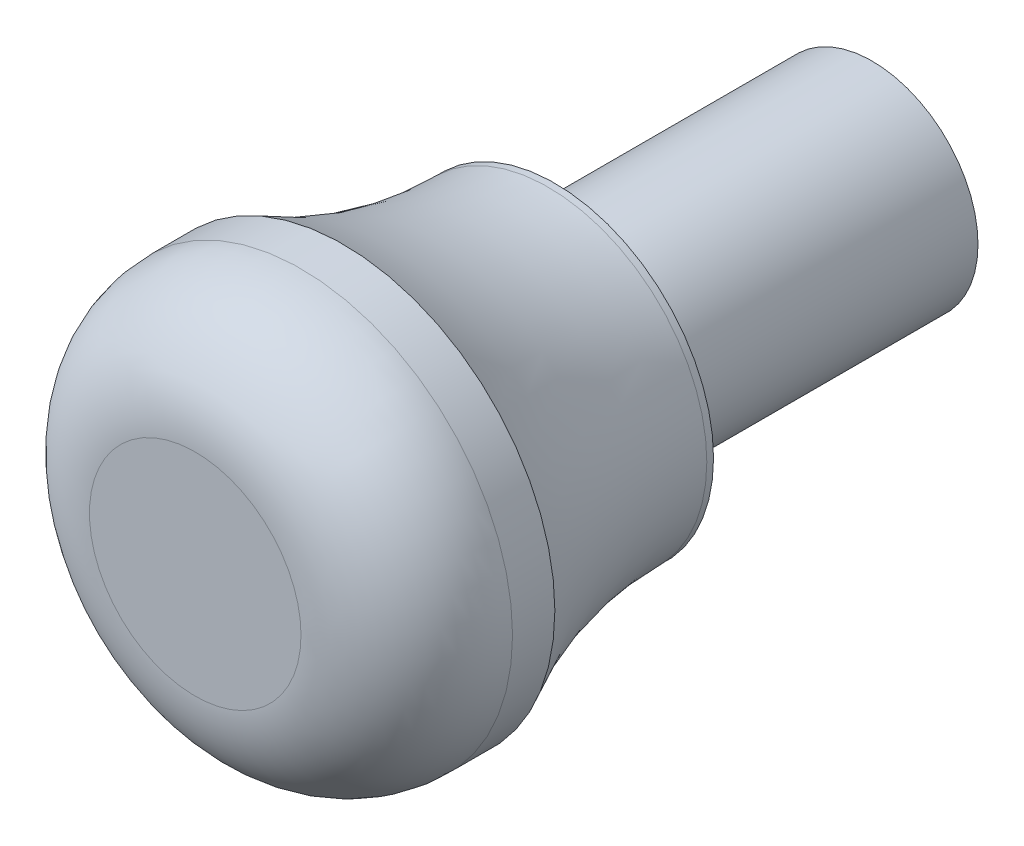
ISO-10303-21;
HEADER;
FILE_DESCRIPTION(('STEP AP214'),'2;1');
FILE_NAME('part.step','',(''),(''),'','','');
FILE_SCHEMA(('AUTOMOTIVE_DESIGN { 1 0 10303 214 1 1 1 1 }'));
ENDSEC;
DATA;
#1=APPLICATION_CONTEXT('core data for automotive mechanical design processes');
#2=APPLICATION_PROTOCOL_DEFINITION('international standard','automotive_design',2000,#1);
#3=PRODUCT_CONTEXT('',#1,'mechanical');
#4=PRODUCT('Part','Part','',(#3));
#5=PRODUCT_RELATED_PRODUCT_CATEGORY('part','',(#4));
#6=PRODUCT_DEFINITION_FORMATION('','',#4);
#7=PRODUCT_DEFINITION_CONTEXT('part definition',#1,'design');
#8=PRODUCT_DEFINITION('design','',#6,#7);
#9=PRODUCT_DEFINITION_SHAPE('','',#8);
#10=(LENGTH_UNIT() NAMED_UNIT(*) SI_UNIT(.MILLI.,.METRE.));
#11=(NAMED_UNIT(*) PLANE_ANGLE_UNIT() SI_UNIT($,.RADIAN.));
#12=(NAMED_UNIT(*) SI_UNIT($,.STERADIAN.) SOLID_ANGLE_UNIT());
#13=UNCERTAINTY_MEASURE_WITH_UNIT(LENGTH_MEASURE(1.E-05),#10,'distance_accuracy_value','');
#14=(GEOMETRIC_REPRESENTATION_CONTEXT(3) GLOBAL_UNCERTAINTY_ASSIGNED_CONTEXT((#13)) GLOBAL_UNIT_ASSIGNED_CONTEXT((#10,
#11,#12)) REPRESENTATION_CONTEXT('',''));
#15=CARTESIAN_POINT('',(0.,0.,0.));
#16=DIRECTION('',(0.,0.,1.));
#17=DIRECTION('',(1.,0.,0.));
#18=AXIS2_PLACEMENT_3D('',#15,#16,#17);
#19=CARTESIAN_POINT('',(0.,0.,15.));
#20=DIRECTION('',(0.,0.,-1.));
#21=DIRECTION('',(-1.,0.,0.));
#22=AXIS2_PLACEMENT_3D('',#19,#20,#21);
#23=CYLINDRICAL_SURFACE('',#22,5.);
#24=CARTESIAN_POINT('',(0.,0.,15.));
#25=DIRECTION('',(0.,0.,1.));
#26=DIRECTION('',(1.,0.,0.));
#27=AXIS2_PLACEMENT_3D('',#24,#25,#26);
#28=CIRCLE('',#27,5.);
#29=CARTESIAN_POINT('',(5.,0.,15.));
#30=VERTEX_POINT('',#29);
#31=EDGE_CURVE('E50',#30,#30,#28,.T.);
#32=ORIENTED_EDGE('',*,*,#31,.F.);
#33=EDGE_LOOP('',(#32));
#34=FACE_BOUND('',#33,.T.);
#35=CARTESIAN_POINT('',(0.,0.,0.));
#36=DIRECTION('',(0.,0.,1.));
#37=DIRECTION('',(1.,0.,0.));
#38=AXIS2_PLACEMENT_3D('',#35,#36,#37);
#39=CIRCLE('',#38,5.);
#40=CARTESIAN_POINT('',(5.,0.,0.));
#41=VERTEX_POINT('',#40);
#42=EDGE_CURVE('E53',#41,#41,#39,.T.);
#43=ORIENTED_EDGE('',*,*,#42,.T.);
#44=EDGE_LOOP('',(#43));
#45=FACE_BOUND('',#44,.T.);
#46=ADVANCED_FACE('F35',(#34,#45),#23,.T.);
#47=CARTESIAN_POINT('',(0.,0.,0.));
#48=DIRECTION('',(0.,0.,1.));
#49=DIRECTION('',(1.,0.,0.));
#50=AXIS2_PLACEMENT_3D('',#47,#48,#49);
#51=PLANE('',#50);
#52=ORIENTED_EDGE('',*,*,#42,.F.);
#53=EDGE_LOOP('',(#52));
#54=FACE_BOUND('',#53,.T.);
#55=ADVANCED_FACE('F80',(#54),#51,.F.);
#56=CARTESIAN_POINT('',(0.,0.,25.));
#57=DIRECTION('',(0.,0.,-1.));
#58=DIRECTION('',(-1.,0.,0.));
#59=AXIS2_PLACEMENT_3D('',#56,#57,#58);
#60=CYLINDRICAL_SURFACE('',#59,7.5);
#61=CARTESIAN_POINT('',(0.,0.,15.3175416344815));
#62=DIRECTION('',(0.,0.,1.));
#63=DIRECTION('',(1.,0.,0.));
#64=AXIS2_PLACEMENT_3D('',#61,#62,#63);
#65=CIRCLE('',#64,7.5);
#66=CARTESIAN_POINT('',(7.5,0.,15.3175416344815));
#67=VERTEX_POINT('',#66);
#68=EDGE_CURVE('E46',#67,#67,#65,.F.);
#69=ORIENTED_EDGE('',*,*,#68,.T.);
#70=EDGE_LOOP('',(#69));
#71=FACE_BOUND('',#70,.T.);
#72=CARTESIAN_POINT('',(0.,0.,15.));
#73=DIRECTION('',(0.,0.,1.));
#74=DIRECTION('',(1.,0.,0.));
#75=AXIS2_PLACEMENT_3D('',#72,#73,#74);
#76=CIRCLE('',#75,7.5);
#77=CARTESIAN_POINT('',(7.5,0.,15.));
#78=VERTEX_POINT('',#77);
#79=EDGE_CURVE('E56',#78,#78,#76,.T.);
#80=ORIENTED_EDGE('',*,*,#79,.T.);
#81=EDGE_LOOP('',(#80));
#82=FACE_BOUND('',#81,.T.);
#83=ADVANCED_FACE('F85',(#71,#82),#60,.T.);
#84=CARTESIAN_POINT('',(0.,0.,15.));
#85=DIRECTION('',(0.,0.,1.));
#86=DIRECTION('',(1.,0.,0.));
#87=AXIS2_PLACEMENT_3D('',#84,#85,#86);
#88=PLANE('',#87);
#89=ORIENTED_EDGE('',*,*,#31,.T.);
#90=EDGE_LOOP('',(#89));
#91=FACE_BOUND('',#90,.T.);
#92=ORIENTED_EDGE('',*,*,#79,.F.);
#93=EDGE_LOOP('',(#92));
#94=FACE_BOUND('',#93,.T.);
#95=ADVANCED_FACE('F93',(#91,#94),#88,.F.);
#96=CARTESIAN_POINT('',(0.,0.,32.));
#97=DIRECTION('',(0.,0.,-1.));
#98=DIRECTION('',(-1.,0.,0.));
#99=AXIS2_PLACEMENT_3D('',#96,#97,#98);
#100=CYLINDRICAL_SURFACE('',#99,10.);
#101=CARTESIAN_POINT('',(0.,0.,27.));
#102=DIRECTION('',(0.,0.,1.));
#103=DIRECTION('',(1.,0.,0.));
#104=AXIS2_PLACEMENT_3D('',#101,#102,#103);
#105=CIRCLE('',#104,10.);
#106=CARTESIAN_POINT('',(10.,0.,27.));
#107=VERTEX_POINT('',#106);
#108=EDGE_CURVE('E10',#107,#107,#105,.F.);
#109=ORIENTED_EDGE('',*,*,#108,.T.);
#110=EDGE_LOOP('',(#109));
#111=FACE_BOUND('',#110,.T.);
#112=CARTESIAN_POINT('',(0.,0.,25.));
#113=DIRECTION('',(0.,0.,1.));
#114=DIRECTION('',(1.,0.,0.));
#115=AXIS2_PLACEMENT_3D('',#112,#113,#114);
#116=CIRCLE('',#115,10.);
#117=CARTESIAN_POINT('',(10.,0.,25.));
#118=VERTEX_POINT('',#117);
#119=EDGE_CURVE('E61',#118,#118,#116,.T.);
#120=ORIENTED_EDGE('',*,*,#119,.T.);
#121=EDGE_LOOP('',(#120));
#122=FACE_BOUND('',#121,.T.);
#123=ADVANCED_FACE('F65',(#111,#122),#100,.T.);
#124=CARTESIAN_POINT('',(0.,0.,32.));
#125=DIRECTION('',(0.,0.,1.));
#126=DIRECTION('',(1.,0.,0.));
#127=AXIS2_PLACEMENT_3D('',#124,#125,#126);
#128=PLANE('',#127);
#129=CARTESIAN_POINT('',(0.,0.,32.));
#130=DIRECTION('',(0.,0.,1.));
#131=DIRECTION('',(1.,0.,0.));
#132=AXIS2_PLACEMENT_3D('',#129,#130,#131);
#133=CIRCLE('',#132,5.);
#134=CARTESIAN_POINT('',(5.,0.,32.));
#135=VERTEX_POINT('',#134);
#136=EDGE_CURVE('E42',#135,#135,#133,.T.);
#137=ORIENTED_EDGE('',*,*,#136,.T.);
#138=EDGE_LOOP('',(#137));
#139=FACE_BOUND('',#138,.T.);
#140=ADVANCED_FACE('F69',(#139),#128,.T.);
#141=CARTESIAN_POINT('',(0.,0.,15.3175416344815));
#142=DIRECTION('',(0.,0.,1.));
#143=DIRECTION('',(1.,0.,0.));
#144=AXIS2_PLACEMENT_3D('',#141,#142,#143);
#145=TOROIDAL_SURFACE('',#144,27.5,20.);
#146=ORIENTED_EDGE('',*,*,#68,.F.);
#147=EDGE_LOOP('',(#146));
#148=FACE_BOUND('',#147,.T.);
#149=ORIENTED_EDGE('',*,*,#119,.F.);
#150=EDGE_LOOP('',(#149));
#151=FACE_BOUND('',#150,.T.);
#152=ADVANCED_FACE('F67',(#148,#151),#145,.F.);
#153=CARTESIAN_POINT('',(0.,0.,27.));
#154=DIRECTION('',(0.,0.,1.));
#155=DIRECTION('',(1.,0.,0.));
#156=AXIS2_PLACEMENT_3D('',#153,#154,#155);
#157=DEGENERATE_TOROIDAL_SURFACE('',#156,5.,5.,.T.);
#158=ORIENTED_EDGE('',*,*,#108,.F.);
#159=EDGE_LOOP('',(#158));
#160=FACE_BOUND('',#159,.T.);
#161=ORIENTED_EDGE('',*,*,#136,.F.);
#162=EDGE_LOOP('',(#161));
#163=FACE_BOUND('',#162,.T.);
#164=ADVANCED_FACE('F37',(#160,#163),#157,.T.);
#165=CLOSED_SHELL('',(#46,#55,#83,#95,#123,#140,#152,#164));
#166=MANIFOLD_SOLID_BREP('B2',#165);
#167=ADVANCED_BREP_SHAPE_REPRESENTATION('',(#18,#166),#14);
#168=SHAPE_DEFINITION_REPRESENTATION(#9,#167);
ENDSEC;
END-ISO-10303-21;
